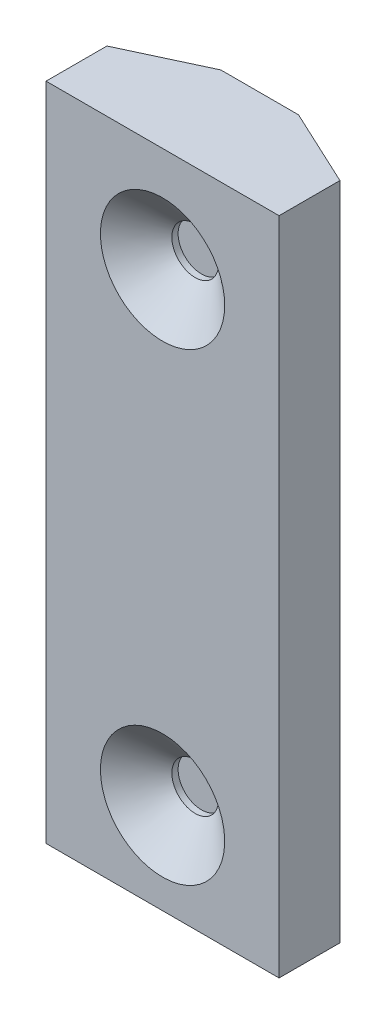
ISO-10303-21;
HEADER;
FILE_DESCRIPTION(('STEP AP214'),'2;1');
FILE_NAME('part.step','',(''),(''),'','','');
FILE_SCHEMA(('AUTOMOTIVE_DESIGN { 1 0 10303 214 1 1 1 1 }'));
ENDSEC;
DATA;
#1=APPLICATION_CONTEXT('core data for automotive mechanical design processes');
#2=APPLICATION_PROTOCOL_DEFINITION('international standard','automotive_design',2000,#1);
#3=PRODUCT_CONTEXT('',#1,'mechanical');
#4=PRODUCT('Part','Part','',(#3));
#5=PRODUCT_RELATED_PRODUCT_CATEGORY('part','',(#4));
#6=PRODUCT_DEFINITION_FORMATION('','',#4);
#7=PRODUCT_DEFINITION_CONTEXT('part definition',#1,'design');
#8=PRODUCT_DEFINITION('design','',#6,#7);
#9=PRODUCT_DEFINITION_SHAPE('','',#8);
#10=(LENGTH_UNIT() NAMED_UNIT(*) SI_UNIT(.MILLI.,.METRE.));
#11=(NAMED_UNIT(*) PLANE_ANGLE_UNIT() SI_UNIT($,.RADIAN.));
#12=(NAMED_UNIT(*) SI_UNIT($,.STERADIAN.) SOLID_ANGLE_UNIT());
#13=UNCERTAINTY_MEASURE_WITH_UNIT(LENGTH_MEASURE(1.E-05),#10,'distance_accuracy_value','');
#14=(GEOMETRIC_REPRESENTATION_CONTEXT(3) GLOBAL_UNCERTAINTY_ASSIGNED_CONTEXT((#13)) GLOBAL_UNIT_ASSIGNED_CONTEXT((#10,
#11,#12)) REPRESENTATION_CONTEXT('',''));
#15=CARTESIAN_POINT('',(0.,0.,0.));
#16=DIRECTION('',(0.,0.,1.));
#17=DIRECTION('',(1.,0.,0.));
#18=AXIS2_PLACEMENT_3D('',#15,#16,#17);
#19=CARTESIAN_POINT('',(1.,17.,-2.5));
#20=DIRECTION('',(-0.422618261740697,0.,0.906307787036651));
#21=DIRECTION('',(0.906307787036651,0.,0.422618261740697));
#22=AXIS2_PLACEMENT_3D('',#19,#20,#21);
#23=PLANE('',#22);
#24=DIRECTION('',(-0.906307787036651,0.,-0.422618261740697));
#25=VECTOR('',#24,1.);
#26=CARTESIAN_POINT('',(1.,0.,-2.5));
#27=LINE('',#26,#25);
#28=CARTESIAN_POINT('',(3.,0.,-1.56738468369001));
#29=VERTEX_POINT('',#28);
#30=CARTESIAN_POINT('',(1.,0.,-2.5));
#31=VERTEX_POINT('',#30);
#32=EDGE_CURVE('E124',#29,#31,#27,.T.);
#33=ORIENTED_EDGE('',*,*,#32,.T.);
#34=DIRECTION('',(0.,-1.,0.));
#35=VECTOR('',#34,1.);
#36=CARTESIAN_POINT('',(1.,17.,-2.5));
#37=LINE('',#36,#35);
#38=CARTESIAN_POINT('',(1.,17.,-2.5));
#39=VERTEX_POINT('',#38);
#40=EDGE_CURVE('E142',#39,#31,#37,.T.);
#41=ORIENTED_EDGE('',*,*,#40,.F.);
#42=DIRECTION('',(-0.906307787036651,0.,-0.422618261740697));
#43=VECTOR('',#42,1.);
#44=CARTESIAN_POINT('',(1.,17.,-2.5));
#45=LINE('',#44,#43);
#46=CARTESIAN_POINT('',(3.,17.,-1.56738468369001));
#47=VERTEX_POINT('',#46);
#48=EDGE_CURVE('E135',#47,#39,#45,.T.);
#49=ORIENTED_EDGE('',*,*,#48,.F.);
#50=DIRECTION('',(0.,-1.,0.));
#51=VECTOR('',#50,1.);
#52=CARTESIAN_POINT('',(3.,17.,-1.56738468369001));
#53=LINE('',#52,#51);
#54=EDGE_CURVE('E120',#47,#29,#53,.T.);
#55=ORIENTED_EDGE('',*,*,#54,.T.);
#56=EDGE_LOOP('',(#33,#41,#49,#55));
#57=FACE_BOUND('',#56,.T.);
#58=ADVANCED_FACE('F38',(#57),#23,.F.);
#59=CARTESIAN_POINT('',(-0.999999999999999,17.,-2.5));
#60=DIRECTION('',(0.,0.,1.));
#61=DIRECTION('',(1.,0.,0.));
#62=AXIS2_PLACEMENT_3D('',#59,#60,#61);
#63=PLANE('',#62);
#64=DIRECTION('',(-1.,0.,0.));
#65=VECTOR('',#64,1.);
#66=CARTESIAN_POINT('',(-0.999999999999999,0.,-2.5));
#67=LINE('',#66,#65);
#68=CARTESIAN_POINT('',(-0.999999999999999,0.,-2.5));
#69=VERTEX_POINT('',#68);
#70=EDGE_CURVE('E127',#31,#69,#67,.T.);
#71=ORIENTED_EDGE('',*,*,#70,.T.);
#72=DIRECTION('',(0.,-1.,0.));
#73=VECTOR('',#72,1.);
#74=CARTESIAN_POINT('',(-0.999999999999999,17.,-2.5));
#75=LINE('',#74,#73);
#76=CARTESIAN_POINT('',(-0.999999999999999,17.,-2.5));
#77=VERTEX_POINT('',#76);
#78=EDGE_CURVE('E139',#77,#69,#75,.T.);
#79=ORIENTED_EDGE('',*,*,#78,.F.);
#80=DIRECTION('',(-1.,0.,0.));
#81=VECTOR('',#80,1.);
#82=CARTESIAN_POINT('',(-0.999999999999999,17.,-2.5));
#83=LINE('',#82,#81);
#84=EDGE_CURVE('E93',#39,#77,#83,.T.);
#85=ORIENTED_EDGE('',*,*,#84,.F.);
#86=ORIENTED_EDGE('',*,*,#40,.T.);
#87=EDGE_LOOP('',(#71,#79,#85,#86));
#88=FACE_BOUND('',#87,.T.);
#89=ADVANCED_FACE('F176',(#88),#63,.F.);
#90=CARTESIAN_POINT('',(-3.,17.,-1.56738468369001));
#91=DIRECTION('',(0.422618261740697,0.,0.906307787036651));
#92=DIRECTION('',(0.906307787036651,0.,-0.422618261740697));
#93=AXIS2_PLACEMENT_3D('',#90,#91,#92);
#94=PLANE('',#93);
#95=DIRECTION('',(-0.906307787036651,0.,0.422618261740697));
#96=VECTOR('',#95,1.);
#97=CARTESIAN_POINT('',(-3.,0.,-1.56738468369001));
#98=LINE('',#97,#96);
#99=CARTESIAN_POINT('',(-3.,0.,-1.56738468369001));
#100=VERTEX_POINT('',#99);
#101=EDGE_CURVE('E130',#69,#100,#98,.T.);
#102=ORIENTED_EDGE('',*,*,#101,.T.);
#103=DIRECTION('',(0.,-1.,0.));
#104=VECTOR('',#103,1.);
#105=CARTESIAN_POINT('',(-3.,17.,-1.56738468369001));
#106=LINE('',#105,#104);
#107=CARTESIAN_POINT('',(-3.,17.,-1.56738468369001));
#108=VERTEX_POINT('',#107);
#109=EDGE_CURVE('E115',#108,#100,#106,.T.);
#110=ORIENTED_EDGE('',*,*,#109,.F.);
#111=DIRECTION('',(-0.906307787036651,0.,0.422618261740697));
#112=VECTOR('',#111,1.);
#113=CARTESIAN_POINT('',(-3.,17.,-1.56738468369001));
#114=LINE('',#113,#112);
#115=EDGE_CURVE('E106',#77,#108,#114,.T.);
#116=ORIENTED_EDGE('',*,*,#115,.F.);
#117=ORIENTED_EDGE('',*,*,#78,.T.);
#118=EDGE_LOOP('',(#102,#110,#116,#117));
#119=FACE_BOUND('',#118,.T.);
#120=ADVANCED_FACE('F179',(#119),#94,.F.);
#121=CARTESIAN_POINT('',(-3.,17.,0.));
#122=DIRECTION('',(1.,0.,0.));
#123=DIRECTION('',(0.,0.,-1.));
#124=AXIS2_PLACEMENT_3D('',#121,#122,#123);
#125=PLANE('',#124);
#126=DIRECTION('',(0.,0.,1.));
#127=VECTOR('',#126,1.);
#128=CARTESIAN_POINT('',(-3.,0.,0.));
#129=LINE('',#128,#127);
#130=CARTESIAN_POINT('',(-3.,0.,0.));
#131=VERTEX_POINT('',#130);
#132=EDGE_CURVE('E114',#100,#131,#129,.T.);
#133=ORIENTED_EDGE('',*,*,#132,.T.);
#134=DIRECTION('',(0.,-1.,0.));
#135=VECTOR('',#134,1.);
#136=CARTESIAN_POINT('',(-3.,17.,0.));
#137=LINE('',#136,#135);
#138=CARTESIAN_POINT('',(-3.,17.,0.));
#139=VERTEX_POINT('',#138);
#140=EDGE_CURVE('E111',#139,#131,#137,.T.);
#141=ORIENTED_EDGE('',*,*,#140,.F.);
#142=DIRECTION('',(0.,0.,1.));
#143=VECTOR('',#142,1.);
#144=CARTESIAN_POINT('',(-3.,17.,0.));
#145=LINE('',#144,#143);
#146=EDGE_CURVE('E100',#108,#139,#145,.T.);
#147=ORIENTED_EDGE('',*,*,#146,.F.);
#148=ORIENTED_EDGE('',*,*,#109,.T.);
#149=EDGE_LOOP('',(#133,#141,#147,#148));
#150=FACE_BOUND('',#149,.T.);
#151=ADVANCED_FACE('F112',(#150),#125,.F.);
#152=CARTESIAN_POINT('',(3.,17.,0.));
#153=DIRECTION('',(0.,0.,-1.));
#154=DIRECTION('',(-1.,0.,0.));
#155=AXIS2_PLACEMENT_3D('',#152,#153,#154);
#156=PLANE('',#155);
#157=CARTESIAN_POINT('',(0.,2.35,0.));
#158=DIRECTION('',(0.,0.,-1.));
#159=DIRECTION('',(-1.,0.,0.));
#160=AXIS2_PLACEMENT_3D('',#157,#158,#159);
#161=CIRCLE('',#160,1.60000000000001);
#162=CARTESIAN_POINT('',(-1.60000000000001,2.35,0.));
#163=VERTEX_POINT('',#162);
#164=EDGE_CURVE('E47',#163,#163,#161,.T.);
#165=ORIENTED_EDGE('',*,*,#164,.T.);
#166=EDGE_LOOP('',(#165));
#167=FACE_BOUND('',#166,.T.);
#168=CARTESIAN_POINT('',(0.,14.3,0.));
#169=DIRECTION('',(0.,0.,-1.));
#170=DIRECTION('',(-1.,0.,0.));
#171=AXIS2_PLACEMENT_3D('',#168,#169,#170);
#172=CIRCLE('',#171,1.60000000000001);
#173=CARTESIAN_POINT('',(1.60000000000001,14.3,0.));
#174=VERTEX_POINT('',#173);
#175=EDGE_CURVE('E147',#174,#174,#172,.T.);
#176=ORIENTED_EDGE('',*,*,#175,.T.);
#177=EDGE_LOOP('',(#176));
#178=FACE_BOUND('',#177,.T.);
#179=DIRECTION('',(1.,0.,0.));
#180=VECTOR('',#179,1.);
#181=CARTESIAN_POINT('',(3.,0.,0.));
#182=LINE('',#181,#180);
#183=CARTESIAN_POINT('',(3.,0.,0.));
#184=VERTEX_POINT('',#183);
#185=EDGE_CURVE('E78',#131,#184,#182,.T.);
#186=ORIENTED_EDGE('',*,*,#185,.T.);
#187=DIRECTION('',(0.,-1.,0.));
#188=VECTOR('',#187,1.);
#189=CARTESIAN_POINT('',(3.,17.,0.));
#190=LINE('',#189,#188);
#191=CARTESIAN_POINT('',(3.,17.,0.));
#192=VERTEX_POINT('',#191);
#193=EDGE_CURVE('E116',#192,#184,#190,.T.);
#194=ORIENTED_EDGE('',*,*,#193,.F.);
#195=DIRECTION('',(1.,0.,0.));
#196=VECTOR('',#195,1.);
#197=CARTESIAN_POINT('',(3.,17.,0.));
#198=LINE('',#197,#196);
#199=EDGE_CURVE('E104',#139,#192,#198,.T.);
#200=ORIENTED_EDGE('',*,*,#199,.F.);
#201=ORIENTED_EDGE('',*,*,#140,.T.);
#202=EDGE_LOOP('',(#186,#194,#200,#201));
#203=FACE_BOUND('',#202,.T.);
#204=ADVANCED_FACE('F118',(#167,#178,#203),#156,.F.);
#205=CARTESIAN_POINT('',(3.,17.,-1.56738468369001));
#206=DIRECTION('',(-1.,0.,0.));
#207=DIRECTION('',(0.,0.,1.));
#208=AXIS2_PLACEMENT_3D('',#205,#206,#207);
#209=PLANE('',#208);
#210=DIRECTION('',(0.,0.,-1.));
#211=VECTOR('',#210,1.);
#212=CARTESIAN_POINT('',(3.,0.,-1.56738468369001));
#213=LINE('',#212,#211);
#214=EDGE_CURVE('E84',#184,#29,#213,.T.);
#215=ORIENTED_EDGE('',*,*,#214,.T.);
#216=ORIENTED_EDGE('',*,*,#54,.F.);
#217=DIRECTION('',(0.,0.,-1.));
#218=VECTOR('',#217,1.);
#219=CARTESIAN_POINT('',(3.,17.,-1.56738468369001));
#220=LINE('',#219,#218);
#221=EDGE_CURVE('E55',#192,#47,#220,.T.);
#222=ORIENTED_EDGE('',*,*,#221,.F.);
#223=ORIENTED_EDGE('',*,*,#193,.T.);
#224=EDGE_LOOP('',(#215,#216,#222,#223));
#225=FACE_BOUND('',#224,.T.);
#226=ADVANCED_FACE('F184',(#225),#209,.F.);
#227=CARTESIAN_POINT('',(0.,17.,0.));
#228=DIRECTION('',(0.,-1.,0.));
#229=DIRECTION('',(0.,0.,-1.));
#230=AXIS2_PLACEMENT_3D('',#227,#228,#229);
#231=PLANE('',#230);
#232=ORIENTED_EDGE('',*,*,#48,.T.);
#233=ORIENTED_EDGE('',*,*,#84,.T.);
#234=ORIENTED_EDGE('',*,*,#115,.T.);
#235=ORIENTED_EDGE('',*,*,#146,.T.);
#236=ORIENTED_EDGE('',*,*,#199,.T.);
#237=ORIENTED_EDGE('',*,*,#221,.T.);
#238=EDGE_LOOP('',(#232,#233,#234,#235,#236,#237));
#239=FACE_BOUND('',#238,.T.);
#240=ADVANCED_FACE('F102',(#239),#231,.F.);
#241=CARTESIAN_POINT('',(0.,0.,0.));
#242=DIRECTION('',(0.,-1.,0.));
#243=DIRECTION('',(0.,0.,-1.));
#244=AXIS2_PLACEMENT_3D('',#241,#242,#243);
#245=PLANE('',#244);
#246=ORIENTED_EDGE('',*,*,#32,.F.);
#247=ORIENTED_EDGE('',*,*,#214,.F.);
#248=ORIENTED_EDGE('',*,*,#185,.F.);
#249=ORIENTED_EDGE('',*,*,#132,.F.);
#250=ORIENTED_EDGE('',*,*,#101,.F.);
#251=ORIENTED_EDGE('',*,*,#70,.F.);
#252=EDGE_LOOP('',(#246,#247,#248,#249,#250,#251));
#253=FACE_BOUND('',#252,.T.);
#254=ADVANCED_FACE('F182',(#253),#245,.T.);
#255=CARTESIAN_POINT('',(0.,14.3,-1.));
#256=DIRECTION('',(0.,0.,1.));
#257=DIRECTION('',(1.,0.,0.));
#258=AXIS2_PLACEMENT_3D('',#255,#256,#257);
#259=CYLINDRICAL_SURFACE('',#258,0.6);
#260=CARTESIAN_POINT('',(0.,14.3,-0.839099631177283));
#261=DIRECTION('',(0.,0.,-1.));
#262=DIRECTION('',(-1.,0.,0.));
#263=AXIS2_PLACEMENT_3D('',#260,#261,#262);
#264=CIRCLE('',#263,0.6);
#265=CARTESIAN_POINT('',(0.6,14.3,-0.839099631177283));
#266=VERTEX_POINT('',#265);
#267=EDGE_CURVE('E11',#266,#266,#264,.F.);
#268=ORIENTED_EDGE('',*,*,#267,.T.);
#269=EDGE_LOOP('',(#268));
#270=FACE_BOUND('',#269,.T.);
#271=CARTESIAN_POINT('',(0.,14.3,-1.));
#272=DIRECTION('',(0.,0.,1.));
#273=DIRECTION('',(1.,0.,0.));
#274=AXIS2_PLACEMENT_3D('',#271,#272,#273);
#275=CIRCLE('',#274,0.6);
#276=CARTESIAN_POINT('',(0.6,14.3,-1.));
#277=VERTEX_POINT('',#276);
#278=EDGE_CURVE('E168',#277,#277,#275,.T.);
#279=ORIENTED_EDGE('',*,*,#278,.F.);
#280=EDGE_LOOP('',(#279));
#281=FACE_BOUND('',#280,.T.);
#282=ADVANCED_FACE('F223',(#270,#281),#259,.F.);
#283=CARTESIAN_POINT('',(0.,14.3,-1.));
#284=DIRECTION('',(0.,0.,1.));
#285=DIRECTION('',(1.,0.,0.));
#286=AXIS2_PLACEMENT_3D('',#283,#284,#285);
#287=PLANE('',#286);
#288=ORIENTED_EDGE('',*,*,#278,.T.);
#289=EDGE_LOOP('',(#288));
#290=FACE_BOUND('',#289,.T.);
#291=ADVANCED_FACE('F163',(#290),#287,.T.);
#292=CARTESIAN_POINT('',(0.,2.35,-1.));
#293=DIRECTION('',(0.,0.,1.));
#294=DIRECTION('',(1.,0.,0.));
#295=AXIS2_PLACEMENT_3D('',#292,#293,#294);
#296=CYLINDRICAL_SURFACE('',#295,0.6);
#297=CARTESIAN_POINT('',(0.,2.35,-0.839099631177283));
#298=DIRECTION('',(0.,0.,-1.));
#299=DIRECTION('',(-1.,0.,0.));
#300=AXIS2_PLACEMENT_3D('',#297,#298,#299);
#301=CIRCLE('',#300,0.6);
#302=CARTESIAN_POINT('',(-0.6,2.35,-0.839099631177283));
#303=VERTEX_POINT('',#302);
#304=EDGE_CURVE('E144',#303,#303,#301,.F.);
#305=ORIENTED_EDGE('',*,*,#304,.T.);
#306=EDGE_LOOP('',(#305));
#307=FACE_BOUND('',#306,.T.);
#308=CARTESIAN_POINT('',(0.,2.35,-1.));
#309=DIRECTION('',(0.,0.,1.));
#310=DIRECTION('',(1.,0.,0.));
#311=AXIS2_PLACEMENT_3D('',#308,#309,#310);
#312=CIRCLE('',#311,0.6);
#313=CARTESIAN_POINT('',(0.6,2.35,-1.));
#314=VERTEX_POINT('',#313);
#315=EDGE_CURVE('E128',#314,#314,#312,.T.);
#316=ORIENTED_EDGE('',*,*,#315,.F.);
#317=EDGE_LOOP('',(#316));
#318=FACE_BOUND('',#317,.T.);
#319=ADVANCED_FACE('F160',(#307,#318),#296,.F.);
#320=CARTESIAN_POINT('',(0.,2.35,-1.));
#321=DIRECTION('',(0.,0.,1.));
#322=DIRECTION('',(1.,0.,0.));
#323=AXIS2_PLACEMENT_3D('',#320,#321,#322);
#324=PLANE('',#323);
#325=ORIENTED_EDGE('',*,*,#315,.T.);
#326=EDGE_LOOP('',(#325));
#327=FACE_BOUND('',#326,.T.);
#328=ADVANCED_FACE('F157',(#327),#324,.T.);
#329=CARTESIAN_POINT('',(0.,2.35,-0.839099631177283));
#330=DIRECTION('',(0.,0.,1.));
#331=DIRECTION('',(1.,0.,0.));
#332=AXIS2_PLACEMENT_3D('',#329,#330,#331);
#333=CONICAL_SURFACE('',#332,0.6,0.872664625997166);
#334=ORIENTED_EDGE('',*,*,#164,.F.);
#335=EDGE_LOOP('',(#334));
#336=FACE_BOUND('',#335,.T.);
#337=ORIENTED_EDGE('',*,*,#304,.F.);
#338=EDGE_LOOP('',(#337));
#339=FACE_BOUND('',#338,.T.);
#340=ADVANCED_FACE('F154',(#336,#339),#333,.F.);
#341=CARTESIAN_POINT('',(0.,14.3,-0.839099631177283));
#342=DIRECTION('',(0.,0.,1.));
#343=DIRECTION('',(1.,0.,0.));
#344=AXIS2_PLACEMENT_3D('',#341,#342,#343);
#345=CONICAL_SURFACE('',#344,0.6,0.872664625997166);
#346=CARTESIAN_POINT('',(1.60000000000001,14.3,0.));
#347=CARTESIAN_POINT('',(1.58958333333334,14.3,-0.00874062115809587));
#348=CARTESIAN_POINT('',(1.57916666666667,14.3,-0.0174812423161926));
#349=CARTESIAN_POINT('',(1.55833333333334,14.3,-0.0349624846323859));
#350=CARTESIAN_POINT('',(1.54791666666667,14.3,-0.0437031057904826));
#351=CARTESIAN_POINT('',(1.52708333333334,14.3,-0.0611843481066761));
#352=CARTESIAN_POINT('',(1.51666666666667,14.3,-0.0699249692647728));
#353=CARTESIAN_POINT('',(1.49583333333334,14.3,-0.0874062115809662));
#354=CARTESIAN_POINT('',(1.48541666666667,14.3,-0.0961468327390628));
#355=CARTESIAN_POINT('',(1.46458333333334,14.3,-0.113628075055256));
#356=CARTESIAN_POINT('',(1.45416666666667,14.3,-0.122368696213353));
#357=CARTESIAN_POINT('',(1.43333333333334,14.3,-0.139849938529546));
#358=CARTESIAN_POINT('',(1.42291666666667,14.3,-0.148590559687643));
#359=CARTESIAN_POINT('',(1.40208333333334,14.3,-0.166071802003837));
#360=CARTESIAN_POINT('',(1.39166666666667,14.3,-0.174812423161933));
#361=CARTESIAN_POINT('',(1.37083333333334,14.3,-0.192293665478127));
#362=CARTESIAN_POINT('',(1.36041666666667,14.3,-0.201034286636223));
#363=CARTESIAN_POINT('',(1.33958333333334,14.3,-0.218515528952417));
#364=CARTESIAN_POINT('',(1.32916666666667,14.3,-0.227256150110513));
#365=CARTESIAN_POINT('',(1.30833333333334,14.3,-0.244737392426707));
#366=CARTESIAN_POINT('',(1.29791666666667,14.3,-0.253478013584804));
#367=CARTESIAN_POINT('',(1.27708333333334,14.3,-0.270959255900997));
#368=CARTESIAN_POINT('',(1.26666666666667,14.3,-0.279699877059094));
#369=CARTESIAN_POINT('',(1.24583333333334,14.3,-0.297181119375287));
#370=CARTESIAN_POINT('',(1.23541666666667,14.3,-0.305921740533384));
#371=CARTESIAN_POINT('',(1.21458333333334,14.3,-0.323402982849577));
#372=CARTESIAN_POINT('',(1.20416666666667,14.3,-0.332143604007674));
#373=CARTESIAN_POINT('',(1.18333333333334,14.3,-0.349624846323867));
#374=CARTESIAN_POINT('',(1.17291666666667,14.3,-0.358365467481964));
#375=CARTESIAN_POINT('',(1.15208333333334,14.3,-0.375846709798157));
#376=CARTESIAN_POINT('',(1.14166666666667,14.3,-0.384587330956254));
#377=CARTESIAN_POINT('',(1.12083333333334,14.3,-0.402068573272448));
#378=CARTESIAN_POINT('',(1.11041666666667,14.3,-0.410809194430544));
#379=CARTESIAN_POINT('',(1.08958333333334,14.3,-0.428290436746738));
#380=CARTESIAN_POINT('',(1.07916666666667,14.3,-0.437031057904834));
#381=CARTESIAN_POINT('',(1.05833333333334,14.3,-0.454512300221028));
#382=CARTESIAN_POINT('',(1.04791666666667,14.3,-0.463252921379124));
#383=CARTESIAN_POINT('',(1.02708333333334,14.3,-0.480734163695318));
#384=CARTESIAN_POINT('',(1.01666666666667,14.3,-0.489474784853415));
#385=CARTESIAN_POINT('',(0.995833333333336,14.3,-0.506956027169608));
#386=CARTESIAN_POINT('',(0.985416666666669,14.3,-0.515696648327705));
#387=CARTESIAN_POINT('',(0.964583333333336,14.3,-0.533177890643898));
#388=CARTESIAN_POINT('',(0.954166666666669,14.3,-0.541918511801995));
#389=CARTESIAN_POINT('',(0.933333333333335,14.3,-0.559399754118188));
#390=CARTESIAN_POINT('',(0.922916666666669,14.3,-0.568140375276285));
#391=CARTESIAN_POINT('',(0.902083333333335,14.3,-0.585621617592478));
#392=CARTESIAN_POINT('',(0.891666666666668,14.3,-0.594362238750575));
#393=CARTESIAN_POINT('',(0.870833333333335,14.3,-0.611843481066768));
#394=CARTESIAN_POINT('',(0.860416666666668,14.3,-0.620584102224865));
#395=CARTESIAN_POINT('',(0.839583333333335,14.3,-0.638065344541058));
#396=CARTESIAN_POINT('',(0.829166666666668,14.3,-0.646805965699155));
#397=CARTESIAN_POINT('',(0.808333333333335,14.3,-0.664287208015349));
#398=CARTESIAN_POINT('',(0.797916666666668,14.3,-0.673027829173445));
#399=CARTESIAN_POINT('',(0.777083333333334,14.3,-0.690509071489639));
#400=CARTESIAN_POINT('',(0.766666666666668,14.3,-0.699249692647736));
#401=CARTESIAN_POINT('',(0.745833333333334,14.3,-0.716730934963929));
#402=CARTESIAN_POINT('',(0.735416666666667,14.3,-0.725471556122026));
#403=CARTESIAN_POINT('',(0.714583333333334,14.3,-0.742952798438219));
#404=CARTESIAN_POINT('',(0.704166666666667,14.3,-0.751693419596316));
#405=CARTESIAN_POINT('',(0.683333333333334,14.3,-0.769174661912509));
#406=CARTESIAN_POINT('',(0.672916666666667,14.3,-0.777915283070606));
#407=CARTESIAN_POINT('',(0.652083333333334,14.3,-0.795396525386799));
#408=CARTESIAN_POINT('',(0.641666666666667,14.3,-0.804137146544896));
#409=CARTESIAN_POINT('',(0.620833333333334,14.3,-0.82161838886109));
#410=CARTESIAN_POINT('',(0.610416666666667,14.3,-0.830359010019186));
#411=CARTESIAN_POINT('',(0.6,14.3,-0.839099631177283));
#412=B_SPLINE_CURVE_WITH_KNOTS('',3,(#346,#347,#348,#349,#350,#351,#352,#353,#354,#355,#356,
#357,#358,#359,#360,#361,#362,#363,#364,#365,#366,#367,#368,#369,#370,#371,#372,#373,#374,#375,
#376,#377,#378,#379,#380,#381,#382,#383,#384,#385,#386,#387,#388,#389,#390,#391,#392,#393,#394,
#395,#396,#397,#398,#399,#400,#401,#402,#403,#404,#405,#406,#407,#408,#409,#410,#411),
.UNSPECIFIED.,.F.,.F.,(4,2,2,2,2,2,2,2,2,2,2,2,2,2,2,2,2,2,2,2,2,2,2,2,2,2,2,2,2,2,2,2,4),(0.,
0.040793977791634,0.0815879555832679,0.122381933374902,0.163175911166536,0.20396988895817,
0.244763866749803,0.285557844541438,0.326351822333071,0.367145800124706,0.407939777916339,
0.448733755707973,0.489527733499607,0.530321711291241,0.571115689082875,0.611909666874509,
0.652703644666143,0.693497622457777,0.734291600249411,0.775085578041045,0.815879555832679,
0.856673533624313,0.897467511415946,0.93826148920758,0.979055466999214,1.01984944479085,
1.06064342258248,1.10143740037412,1.14223137816575,1.18302535595738,1.22381933374902,
1.26461331154065,1.30540728933229),.UNSPECIFIED.);
#413=EDGE_CURVE('BSEAM40',#174,#266,#412,.T.);
#414=ORIENTED_EDGE('',*,*,#175,.F.);
#415=ORIENTED_EDGE('',*,*,#267,.F.);
#416=ORIENTED_EDGE('',*,*,#413,.T.);
#417=ORIENTED_EDGE('',*,*,#413,.F.);
#418=EDGE_LOOP('',(#414,#416,#415,#417));
#419=FACE_BOUND('',#418,.T.);
#420=ADVANCED_FACE('F40',(#419),#345,.F.);
#421=CLOSED_SHELL('',(#58,#89,#120,#151,#204,#226,#240,#254,#282,#291,#319,#328,#340,#420));
#422=MANIFOLD_SOLID_BREP('B2',#421);
#423=ADVANCED_BREP_SHAPE_REPRESENTATION('',(#18,#422),#14);
#424=SHAPE_DEFINITION_REPRESENTATION(#9,#423);
ENDSEC;
END-ISO-10303-21;
